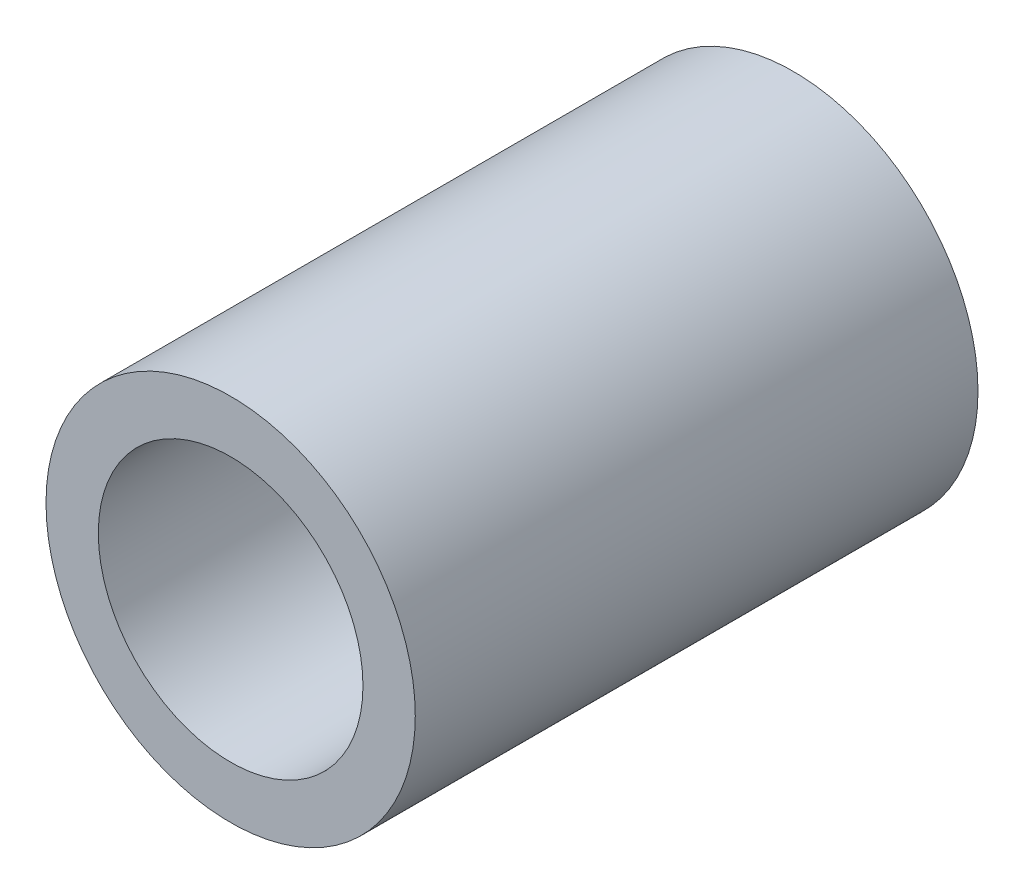
ISO-10303-21;
HEADER;
FILE_DESCRIPTION(('STEP AP214'),'2;1');
FILE_NAME('part.step','',(''),(''),'','','');
FILE_SCHEMA(('AUTOMOTIVE_DESIGN { 1 0 10303 214 1 1 1 1 }'));
ENDSEC;
DATA;
#1=APPLICATION_CONTEXT('core data for automotive mechanical design processes');
#2=APPLICATION_PROTOCOL_DEFINITION('international standard','automotive_design',2000,#1);
#3=PRODUCT_CONTEXT('',#1,'mechanical');
#4=PRODUCT('Part','Part','',(#3));
#5=PRODUCT_RELATED_PRODUCT_CATEGORY('part','',(#4));
#6=PRODUCT_DEFINITION_FORMATION('','',#4);
#7=PRODUCT_DEFINITION_CONTEXT('part definition',#1,'design');
#8=PRODUCT_DEFINITION('design','',#6,#7);
#9=PRODUCT_DEFINITION_SHAPE('','',#8);
#10=(LENGTH_UNIT() NAMED_UNIT(*) SI_UNIT(.MILLI.,.METRE.));
#11=(NAMED_UNIT(*) PLANE_ANGLE_UNIT() SI_UNIT($,.RADIAN.));
#12=(NAMED_UNIT(*) SI_UNIT($,.STERADIAN.) SOLID_ANGLE_UNIT());
#13=UNCERTAINTY_MEASURE_WITH_UNIT(LENGTH_MEASURE(1.E-05),#10,'distance_accuracy_value','');
#14=(GEOMETRIC_REPRESENTATION_CONTEXT(3) GLOBAL_UNCERTAINTY_ASSIGNED_CONTEXT((#13)) GLOBAL_UNIT_ASSIGNED_CONTEXT((#10,
#11,#12)) REPRESENTATION_CONTEXT('',''));
#15=CARTESIAN_POINT('',(0.,0.,0.));
#16=DIRECTION('',(0.,0.,1.));
#17=DIRECTION('',(1.,0.,0.));
#18=AXIS2_PLACEMENT_3D('',#15,#16,#17);
#19=CARTESIAN_POINT('',(0.,0.,0.));
#20=DIRECTION('',(0.,0.,1.));
#21=DIRECTION('',(1.,0.,0.));
#22=AXIS2_PLACEMENT_3D('',#19,#20,#21);
#23=PLANE('',#22);
#24=CARTESIAN_POINT('',(0.,0.,0.));
#25=DIRECTION('',(0.,0.,1.));
#26=DIRECTION('',(1.,0.,0.));
#27=AXIS2_PLACEMENT_3D('',#24,#25,#26);
#28=CIRCLE('',#27,4.5);
#29=CARTESIAN_POINT('',(4.5,0.,0.));
#30=VERTEX_POINT('',#29);
#31=EDGE_CURVE('E41',#30,#30,#28,.T.);
#32=ORIENTED_EDGE('',*,*,#31,.T.);
#33=EDGE_LOOP('',(#32));
#34=FACE_BOUND('',#33,.T.);
#35=CARTESIAN_POINT('',(0.,0.,0.));
#36=DIRECTION('',(0.,0.,-1.));
#37=DIRECTION('',(-1.,0.,0.));
#38=AXIS2_PLACEMENT_3D('',#35,#36,#37);
#39=CIRCLE('',#38,7.525);
#40=CARTESIAN_POINT('',(-7.525,0.,0.));
#41=VERTEX_POINT('',#40);
#42=EDGE_CURVE('E68',#41,#41,#39,.T.);
#43=ORIENTED_EDGE('',*,*,#42,.T.);
#44=EDGE_LOOP('',(#43));
#45=FACE_BOUND('',#44,.T.);
#46=ADVANCED_FACE('F37',(#34,#45),#23,.F.);
#47=CARTESIAN_POINT('',(0.,0.,2.));
#48=DIRECTION('',(0.,0.,1.));
#49=DIRECTION('',(1.,0.,0.));
#50=AXIS2_PLACEMENT_3D('',#47,#48,#49);
#51=PLANE('',#50);
#52=CARTESIAN_POINT('',(0.,0.,2.));
#53=DIRECTION('',(0.,0.,1.));
#54=DIRECTION('',(1.,0.,0.));
#55=AXIS2_PLACEMENT_3D('',#52,#53,#54);
#56=CIRCLE('',#55,4.5);
#57=CARTESIAN_POINT('',(4.5,0.,2.));
#58=VERTEX_POINT('',#57);
#59=EDGE_CURVE('E10',#58,#58,#56,.T.);
#60=ORIENTED_EDGE('',*,*,#59,.F.);
#61=EDGE_LOOP('',(#60));
#62=FACE_BOUND('',#61,.T.);
#63=CARTESIAN_POINT('',(0.,0.,2.));
#64=DIRECTION('',(0.,0.,1.));
#65=DIRECTION('',(1.,0.,0.));
#66=AXIS2_PLACEMENT_3D('',#63,#64,#65);
#67=CIRCLE('',#66,7.525);
#68=CARTESIAN_POINT('',(7.525,0.,2.));
#69=VERTEX_POINT('',#68);
#70=EDGE_CURVE('E56',#69,#69,#67,.T.);
#71=ORIENTED_EDGE('',*,*,#70,.T.);
#72=EDGE_LOOP('',(#71));
#73=FACE_BOUND('',#72,.T.);
#74=ADVANCED_FACE('F93',(#62,#73),#51,.T.);
#75=CARTESIAN_POINT('',(0.,0.,2.));
#76=DIRECTION('',(0.,0.,-1.));
#77=DIRECTION('',(-1.,0.,0.));
#78=AXIS2_PLACEMENT_3D('',#75,#76,#77);
#79=CYLINDRICAL_SURFACE('',#78,10.5);
#80=CARTESIAN_POINT('',(0.,0.,17.));
#81=DIRECTION('',(0.,0.,1.));
#82=DIRECTION('',(1.,0.,0.));
#83=AXIS2_PLACEMENT_3D('',#80,#81,#82);
#84=CIRCLE('',#83,10.5);
#85=CARTESIAN_POINT('',(10.5,0.,17.));
#86=VERTEX_POINT('',#85);
#87=EDGE_CURVE('E50',#86,#86,#84,.T.);
#88=ORIENTED_EDGE('',*,*,#87,.F.);
#89=EDGE_LOOP('',(#88));
#90=FACE_BOUND('',#89,.T.);
#91=CARTESIAN_POINT('',(0.,0.,-15.));
#92=DIRECTION('',(0.,0.,-1.));
#93=DIRECTION('',(-1.,0.,0.));
#94=AXIS2_PLACEMENT_3D('',#91,#92,#93);
#95=CIRCLE('',#94,10.5);
#96=CARTESIAN_POINT('',(-10.5,0.,-15.));
#97=VERTEX_POINT('',#96);
#98=EDGE_CURVE('E60',#97,#97,#95,.T.);
#99=ORIENTED_EDGE('',*,*,#98,.F.);
#100=EDGE_LOOP('',(#99));
#101=FACE_BOUND('',#100,.T.);
#102=ADVANCED_FACE('F39',(#90,#101),#79,.T.);
#103=CARTESIAN_POINT('',(0.,0.,2.));
#104=DIRECTION('',(0.,0.,-1.));
#105=DIRECTION('',(-1.,0.,0.));
#106=AXIS2_PLACEMENT_3D('',#103,#104,#105);
#107=CYLINDRICAL_SURFACE('',#106,4.5);
#108=ORIENTED_EDGE('',*,*,#59,.T.);
#109=EDGE_LOOP('',(#108));
#110=FACE_BOUND('',#109,.T.);
#111=ORIENTED_EDGE('',*,*,#31,.F.);
#112=EDGE_LOOP('',(#111));
#113=FACE_BOUND('',#112,.T.);
#114=ADVANCED_FACE('F102',(#110,#113),#107,.F.);
#115=CARTESIAN_POINT('',(0.,0.,17.));
#116=DIRECTION('',(0.,0.,1.));
#117=DIRECTION('',(1.,0.,0.));
#118=AXIS2_PLACEMENT_3D('',#115,#116,#117);
#119=PLANE('',#118);
#120=ORIENTED_EDGE('',*,*,#87,.T.);
#121=EDGE_LOOP('',(#120));
#122=FACE_BOUND('',#121,.T.);
#123=CARTESIAN_POINT('',(0.,0.,17.));
#124=DIRECTION('',(0.,0.,1.));
#125=DIRECTION('',(1.,0.,0.));
#126=AXIS2_PLACEMENT_3D('',#123,#124,#125);
#127=CIRCLE('',#126,7.525);
#128=CARTESIAN_POINT('',(7.525,0.,17.));
#129=VERTEX_POINT('',#128);
#130=EDGE_CURVE('E55',#129,#129,#127,.T.);
#131=ORIENTED_EDGE('',*,*,#130,.F.);
#132=EDGE_LOOP('',(#131));
#133=FACE_BOUND('',#132,.T.);
#134=ADVANCED_FACE('F89',(#122,#133),#119,.T.);
#135=CARTESIAN_POINT('',(0.,0.,17.));
#136=DIRECTION('',(0.,0.,-1.));
#137=DIRECTION('',(-1.,0.,0.));
#138=AXIS2_PLACEMENT_3D('',#135,#136,#137);
#139=CYLINDRICAL_SURFACE('',#138,7.525);
#140=ORIENTED_EDGE('',*,*,#130,.T.);
#141=EDGE_LOOP('',(#140));
#142=FACE_BOUND('',#141,.T.);
#143=ORIENTED_EDGE('',*,*,#70,.F.);
#144=EDGE_LOOP('',(#143));
#145=FACE_BOUND('',#144,.T.);
#146=ADVANCED_FACE('F81',(#142,#145),#139,.F.);
#147=CARTESIAN_POINT('',(0.,0.,-15.));
#148=DIRECTION('',(0.,0.,-1.));
#149=DIRECTION('',(-1.,0.,0.));
#150=AXIS2_PLACEMENT_3D('',#147,#148,#149);
#151=PLANE('',#150);
#152=ORIENTED_EDGE('',*,*,#98,.T.);
#153=EDGE_LOOP('',(#152));
#154=FACE_BOUND('',#153,.T.);
#155=CARTESIAN_POINT('',(0.,0.,-15.));
#156=DIRECTION('',(0.,0.,-1.));
#157=DIRECTION('',(-1.,0.,0.));
#158=AXIS2_PLACEMENT_3D('',#155,#156,#157);
#159=CIRCLE('',#158,7.525);
#160=CARTESIAN_POINT('',(-7.525,0.,-15.));
#161=VERTEX_POINT('',#160);
#162=EDGE_CURVE('E67',#161,#161,#159,.T.);
#163=ORIENTED_EDGE('',*,*,#162,.F.);
#164=EDGE_LOOP('',(#163));
#165=FACE_BOUND('',#164,.T.);
#166=ADVANCED_FACE('F79',(#154,#165),#151,.T.);
#167=CARTESIAN_POINT('',(0.,0.,-15.));
#168=DIRECTION('',(0.,0.,1.));
#169=DIRECTION('',(1.,0.,0.));
#170=AXIS2_PLACEMENT_3D('',#167,#168,#169);
#171=CYLINDRICAL_SURFACE('',#170,7.525);
#172=ORIENTED_EDGE('',*,*,#162,.T.);
#173=EDGE_LOOP('',(#172));
#174=FACE_BOUND('',#173,.T.);
#175=ORIENTED_EDGE('',*,*,#42,.F.);
#176=EDGE_LOOP('',(#175));
#177=FACE_BOUND('',#176,.T.);
#178=ADVANCED_FACE('F76',(#174,#177),#171,.F.);
#179=CLOSED_SHELL('',(#46,#74,#102,#114,#134,#146,#166,#178));
#180=MANIFOLD_SOLID_BREP('B2',#179);
#181=ADVANCED_BREP_SHAPE_REPRESENTATION('',(#18,#180),#14);
#182=SHAPE_DEFINITION_REPRESENTATION(#9,#181);
ENDSEC;
END-ISO-10303-21;
